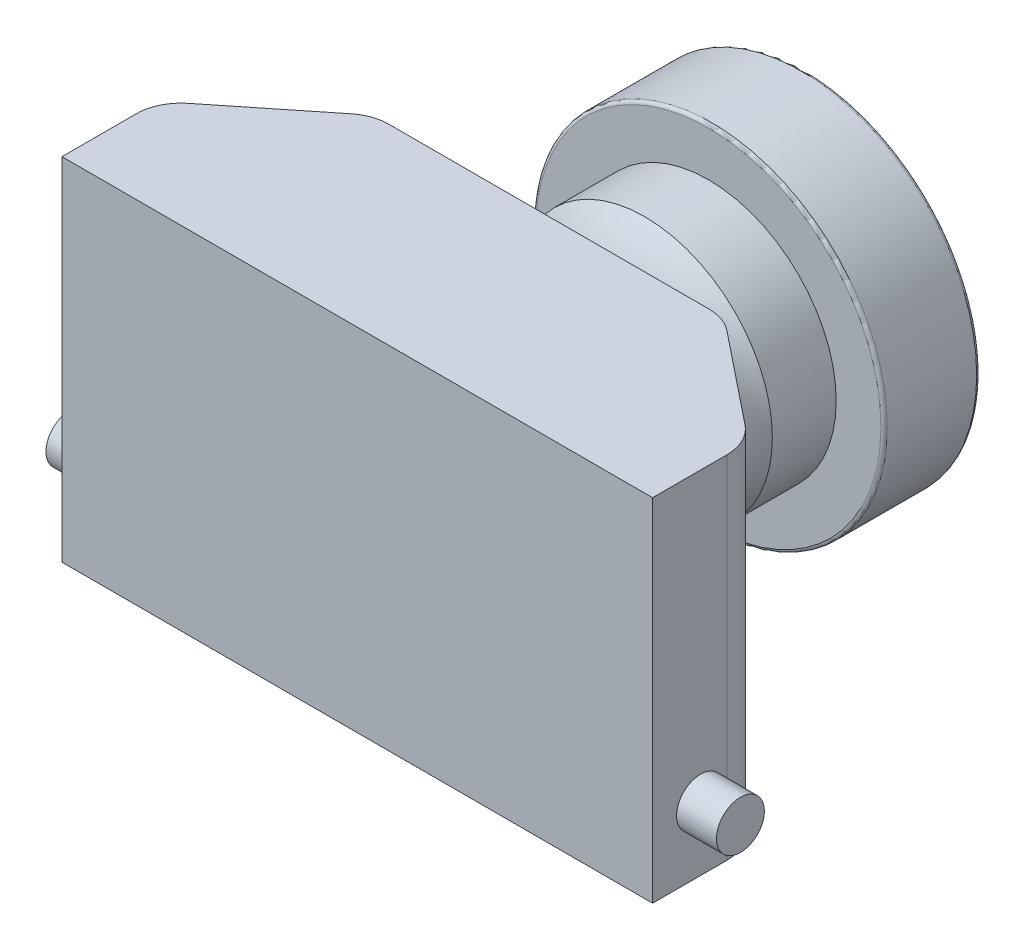
ISO-10303-21;
HEADER;
FILE_DESCRIPTION(('STEP AP214'),'2;1');
FILE_NAME('part.step','',(''),(''),'','','');
FILE_SCHEMA(('AUTOMOTIVE_DESIGN { 1 0 10303 214 1 1 1 1 }'));
ENDSEC;
DATA;
#1=APPLICATION_CONTEXT('core data for automotive mechanical design processes');
#2=APPLICATION_PROTOCOL_DEFINITION('international standard','automotive_design',2000,#1);
#3=PRODUCT_CONTEXT('',#1,'mechanical');
#4=PRODUCT('Part','Part','',(#3));
#5=PRODUCT_RELATED_PRODUCT_CATEGORY('part','',(#4));
#6=PRODUCT_DEFINITION_FORMATION('','',#4);
#7=PRODUCT_DEFINITION_CONTEXT('part definition',#1,'design');
#8=PRODUCT_DEFINITION('design','',#6,#7);
#9=PRODUCT_DEFINITION_SHAPE('','',#8);
#10=(LENGTH_UNIT() NAMED_UNIT(*) SI_UNIT(.MILLI.,.METRE.));
#11=(NAMED_UNIT(*) PLANE_ANGLE_UNIT() SI_UNIT($,.RADIAN.));
#12=(NAMED_UNIT(*) SI_UNIT($,.STERADIAN.) SOLID_ANGLE_UNIT());
#13=UNCERTAINTY_MEASURE_WITH_UNIT(LENGTH_MEASURE(1.E-05),#10,'distance_accuracy_value','');
#14=(GEOMETRIC_REPRESENTATION_CONTEXT(3) GLOBAL_UNCERTAINTY_ASSIGNED_CONTEXT((#13)) GLOBAL_UNIT_ASSIGNED_CONTEXT((#10,
#11,#12)) REPRESENTATION_CONTEXT('',''));
#15=CARTESIAN_POINT('',(0.,0.,0.));
#16=DIRECTION('',(0.,0.,1.));
#17=DIRECTION('',(1.,0.,0.));
#18=AXIS2_PLACEMENT_3D('',#15,#16,#17);
#19=CARTESIAN_POINT('',(0.,0.,-13.8057400215809));
#20=DIRECTION('',(0.,0.,1.));
#21=DIRECTION('',(1.,0.,0.));
#22=AXIS2_PLACEMENT_3D('',#19,#20,#21);
#23=PLANE('',#22);
#24=CARTESIAN_POINT('',(0.,0.,-13.8057400215809));
#25=DIRECTION('',(0.,0.,1.));
#26=DIRECTION('',(1.,0.,0.));
#27=AXIS2_PLACEMENT_3D('',#24,#25,#26);
#28=CIRCLE('',#27,4.75);
#29=CARTESIAN_POINT('',(4.75,0.,-13.8057400215809));
#30=VERTEX_POINT('',#29);
#31=EDGE_CURVE('E12',#30,#30,#28,.T.);
#32=ORIENTED_EDGE('',*,*,#31,.T.);
#33=EDGE_LOOP('',(#32));
#34=FACE_BOUND('',#33,.T.);
#35=ADVANCED_FACE('F42',(#34),#23,.T.);
#36=CARTESIAN_POINT('',(0.0908660493505876,0.,-3.45610375599622));
#37=DIRECTION('',(0.,-1.,0.));
#38=DIRECTION('',(1.,0.,0.));
#39=AXIS2_PLACEMENT_3D('',#36,#37,#38);
#40=CIRCLE('',#39,11.35);
#41=TRIMMED_CURVE('',#40,(PARAMETER_VALUE(-1.57880223164309)),
(PARAMETER_VALUE(1.57880223164309)),.T.,.PARAMETER.);
#42=CARTESIAN_POINT('',(0.,0.,-3.45610375599622));
#43=DIRECTION('',(0.,0.,1.));
#44=AXIS1_PLACEMENT('',#42,#43);
#45=SURFACE_OF_REVOLUTION('',#41,#44);
#46=CARTESIAN_POINT('',(0.,0.,-14.8057400215809));
#47=VERTEX_POINT('',#46);
#48=VERTEX_LOOP('',#47);
#49=FACE_BOUND('',#48,.T.);
#50=ORIENTED_EDGE('',*,*,#31,.F.);
#51=EDGE_LOOP('',(#50));
#52=FACE_BOUND('',#51,.T.);
#53=ADVANCED_FACE('F49',(#49,#52),#45,.T.);
#54=CLOSED_SHELL('',(#35,#53));
#55=MANIFOLD_SOLID_BREP('B2',#54);
#56=CARTESIAN_POINT('',(9.25,5.5,-3.));
#57=DIRECTION('',(-1.,0.,0.));
#58=DIRECTION('',(0.,0.,1.));
#59=AXIS2_PLACEMENT_3D('',#56,#57,#58);
#60=PLANE('',#59);
#61=CARTESIAN_POINT('',(9.25,-3.5,-1.5));
#62=DIRECTION('',(-1.,0.,0.));
#63=DIRECTION('',(0.,0.,1.));
#64=AXIS2_PLACEMENT_3D('',#61,#62,#63);
#65=CIRCLE('',#64,0.75);
#66=CARTESIAN_POINT('',(9.25,-3.5,-0.75));
#67=VERTEX_POINT('',#66);
#68=EDGE_CURVE('E191',#67,#67,#65,.F.);
#69=ORIENTED_EDGE('',*,*,#68,.F.);
#70=EDGE_LOOP('',(#69));
#71=FACE_BOUND('',#70,.T.);
#72=DIRECTION('',(0.,0.,-1.));
#73=VECTOR('',#72,1.);
#74=CARTESIAN_POINT('',(9.25,-5.5,-3.));
#75=LINE('',#74,#73);
#76=CARTESIAN_POINT('',(9.25,-5.5,0.));
#77=VERTEX_POINT('',#76);
#78=CARTESIAN_POINT('',(9.25,-5.5,-2.3271252135188));
#79=VERTEX_POINT('',#78);
#80=EDGE_CURVE('E173',#77,#79,#75,.T.);
#81=ORIENTED_EDGE('',*,*,#80,.T.);
#82=DIRECTION('',(0.,-1.,0.));
#83=VECTOR('',#82,1.);
#84=CARTESIAN_POINT('',(9.25,5.5,-2.3271252135188));
#85=LINE('',#84,#83);
#86=CARTESIAN_POINT('',(9.25,5.5,-2.3271252135188));
#87=VERTEX_POINT('',#86);
#88=EDGE_CURVE('E223',#79,#87,#85,.F.);
#89=ORIENTED_EDGE('',*,*,#88,.T.);
#90=DIRECTION('',(0.,0.,-1.));
#91=VECTOR('',#90,1.);
#92=CARTESIAN_POINT('',(9.25,5.5,-3.));
#93=LINE('',#92,#91);
#94=CARTESIAN_POINT('',(9.25,5.5,0.));
#95=VERTEX_POINT('',#94);
#96=EDGE_CURVE('E187',#95,#87,#93,.T.);
#97=ORIENTED_EDGE('',*,*,#96,.F.);
#98=DIRECTION('',(0.,-1.,0.));
#99=VECTOR('',#98,1.);
#100=CARTESIAN_POINT('',(9.25,5.5,0.));
#101=LINE('',#100,#99);
#102=EDGE_CURVE('E164',#95,#77,#101,.T.);
#103=ORIENTED_EDGE('',*,*,#102,.T.);
#104=EDGE_LOOP('',(#81,#89,#97,#103));
#105=FACE_BOUND('',#104,.T.);
#106=ADVANCED_FACE('F69',(#71,#105),#60,.F.);
#107=CARTESIAN_POINT('',(5.5,5.5,-6.));
#108=DIRECTION('',(-0.624695047554424,0.,0.780868809443031));
#109=DIRECTION('',(0.780868809443031,0.,0.624695047554424));
#110=AXIS2_PLACEMENT_3D('',#107,#108,#109);
#111=PLANE('',#110);
#112=DIRECTION('',(-0.780868809443031,0.,-0.624695047554424));
#113=VECTOR('',#112,1.);
#114=CARTESIAN_POINT('',(5.5,5.5,-6.));
#115=LINE('',#114,#113);
#116=CARTESIAN_POINT('',(8.72457306657619,5.5,-3.42034154673905));
#117=VERTEX_POINT('',#116);
#118=CARTESIAN_POINT('',(5.8834795834747,5.5,-5.69321633322024));
#119=VERTEX_POINT('',#118);
#120=EDGE_CURVE('E257',#117,#119,#115,.T.);
#121=ORIENTED_EDGE('',*,*,#120,.F.);
#122=DIRECTION('',(0.,-1.,0.));
#123=VECTOR('',#122,1.);
#124=CARTESIAN_POINT('',(8.72457306657619,5.5,-3.42034154673905));
#125=LINE('',#124,#123);
#126=CARTESIAN_POINT('',(8.72457306657619,-5.5,-3.42034154673905));
#127=VERTEX_POINT('',#126);
#128=EDGE_CURVE('E212',#117,#127,#125,.T.);
#129=ORIENTED_EDGE('',*,*,#128,.T.);
#130=DIRECTION('',(-0.780868809443031,0.,-0.624695047554424));
#131=VECTOR('',#130,1.);
#132=CARTESIAN_POINT('',(5.5,-5.5,-6.));
#133=LINE('',#132,#131);
#134=CARTESIAN_POINT('',(5.8834795834747,-5.5,-5.69321633322024));
#135=VERTEX_POINT('',#134);
#136=EDGE_CURVE('E176',#127,#135,#133,.T.);
#137=ORIENTED_EDGE('',*,*,#136,.T.);
#138=DIRECTION('',(0.,-1.,0.));
#139=VECTOR('',#138,1.);
#140=CARTESIAN_POINT('',(5.8834795834747,5.5,-5.69321633322024));
#141=LINE('',#140,#139);
#142=EDGE_CURVE('E210',#135,#119,#141,.F.);
#143=ORIENTED_EDGE('',*,*,#142,.T.);
#144=EDGE_LOOP('',(#121,#129,#137,#143));
#145=FACE_BOUND('',#144,.T.);
#146=ADVANCED_FACE('F294',(#145),#111,.F.);
#147=CARTESIAN_POINT('',(-5.5,5.5,-6.));
#148=DIRECTION('',(0.,0.,1.));
#149=DIRECTION('',(1.,0.,0.));
#150=AXIS2_PLACEMENT_3D('',#147,#148,#149);
#151=PLANE('',#150);
#152=CARTESIAN_POINT('',(0.,0.,-6.));
#153=DIRECTION('',(0.,0.,1.));
#154=DIRECTION('',(1.,0.,0.));
#155=AXIS2_PLACEMENT_3D('',#152,#153,#154);
#156=CIRCLE('',#155,4.5);
#157=CARTESIAN_POINT('',(4.5,0.,-6.));
#158=VERTEX_POINT('',#157);
#159=EDGE_CURVE('E271',#158,#158,#156,.T.);
#160=ORIENTED_EDGE('',*,*,#159,.T.);
#161=EDGE_LOOP('',(#160));
#162=FACE_BOUND('',#161,.T.);
#163=DIRECTION('',(-1.,0.,0.));
#164=VECTOR('',#163,1.);
#165=CARTESIAN_POINT('',(-5.5,-5.5,-6.));
#166=LINE('',#165,#164);
#167=CARTESIAN_POINT('',(5.0089065168985,-5.5,-6.));
#168=VERTEX_POINT('',#167);
#169=CARTESIAN_POINT('',(-5.0089065168985,-5.5,-6.));
#170=VERTEX_POINT('',#169);
#171=EDGE_CURVE('E180',#168,#170,#166,.T.);
#172=ORIENTED_EDGE('',*,*,#171,.T.);
#173=DIRECTION('',(0.,-1.,0.));
#174=VECTOR('',#173,1.);
#175=CARTESIAN_POINT('',(-5.0089065168985,5.5,-6.));
#176=LINE('',#175,#174);
#177=CARTESIAN_POINT('',(-5.0089065168985,5.5,-6.));
#178=VERTEX_POINT('',#177);
#179=EDGE_CURVE('E40',#170,#178,#176,.F.);
#180=ORIENTED_EDGE('',*,*,#179,.T.);
#181=DIRECTION('',(-1.,0.,0.));
#182=VECTOR('',#181,1.);
#183=CARTESIAN_POINT('',(-5.5,5.5,-6.));
#184=LINE('',#183,#182);
#185=CARTESIAN_POINT('',(5.0089065168985,5.5,-6.));
#186=VERTEX_POINT('',#185);
#187=EDGE_CURVE('E245',#186,#178,#184,.T.);
#188=ORIENTED_EDGE('',*,*,#187,.F.);
#189=DIRECTION('',(0.,-1.,0.));
#190=VECTOR('',#189,1.);
#191=CARTESIAN_POINT('',(5.0089065168985,5.5,-6.));
#192=LINE('',#191,#190);
#193=EDGE_CURVE('E77',#186,#168,#192,.T.);
#194=ORIENTED_EDGE('',*,*,#193,.T.);
#195=EDGE_LOOP('',(#172,#180,#188,#194));
#196=FACE_BOUND('',#195,.T.);
#197=ADVANCED_FACE('F242',(#162,#196),#151,.F.);
#198=CARTESIAN_POINT('',(-9.25,5.5,-3.));
#199=DIRECTION('',(0.624695047554424,0.,0.78086880944303));
#200=DIRECTION('',(0.78086880944303,0.,-0.624695047554424));
#201=AXIS2_PLACEMENT_3D('',#198,#199,#200);
#202=PLANE('',#201);
#203=DIRECTION('',(-0.78086880944303,0.,0.624695047554424));
#204=VECTOR('',#203,1.);
#205=CARTESIAN_POINT('',(-9.25,-5.5,-3.));
#206=LINE('',#205,#204);
#207=CARTESIAN_POINT('',(-5.8834795834747,-5.5,-5.69321633322024));
#208=VERTEX_POINT('',#207);
#209=CARTESIAN_POINT('',(-8.72457306657619,-5.5,-3.42034154673905));
#210=VERTEX_POINT('',#209);
#211=EDGE_CURVE('E183',#208,#210,#206,.T.);
#212=ORIENTED_EDGE('',*,*,#211,.T.);
#213=DIRECTION('',(0.,-1.,0.));
#214=VECTOR('',#213,1.);
#215=CARTESIAN_POINT('',(-8.72457306657619,5.5,-3.42034154673905));
#216=LINE('',#215,#214);
#217=CARTESIAN_POINT('',(-8.72457306657619,5.5,-3.42034154673905));
#218=VERTEX_POINT('',#217);
#219=EDGE_CURVE('E92',#210,#218,#216,.F.);
#220=ORIENTED_EDGE('',*,*,#219,.T.);
#221=DIRECTION('',(-0.78086880944303,0.,0.624695047554424));
#222=VECTOR('',#221,1.);
#223=CARTESIAN_POINT('',(-9.25,5.5,-3.));
#224=LINE('',#223,#222);
#225=CARTESIAN_POINT('',(-5.8834795834747,5.5,-5.69321633322024));
#226=VERTEX_POINT('',#225);
#227=EDGE_CURVE('E154',#226,#218,#224,.T.);
#228=ORIENTED_EDGE('',*,*,#227,.F.);
#229=DIRECTION('',(0.,-1.,0.));
#230=VECTOR('',#229,1.);
#231=CARTESIAN_POINT('',(-5.8834795834747,5.5,-5.69321633322024));
#232=LINE('',#231,#230);
#233=EDGE_CURVE('E234',#226,#208,#232,.T.);
#234=ORIENTED_EDGE('',*,*,#233,.T.);
#235=EDGE_LOOP('',(#212,#220,#228,#234));
#236=FACE_BOUND('',#235,.T.);
#237=ADVANCED_FACE('F256',(#236),#202,.F.);
#238=CARTESIAN_POINT('',(-9.25,5.5,0.));
#239=DIRECTION('',(1.,0.,0.));
#240=DIRECTION('',(0.,0.,-1.));
#241=AXIS2_PLACEMENT_3D('',#238,#239,#240);
#242=PLANE('',#241);
#243=CARTESIAN_POINT('',(-9.25,-3.5,-1.5));
#244=DIRECTION('',(1.,0.,0.));
#245=DIRECTION('',(0.,0.,-1.));
#246=AXIS2_PLACEMENT_3D('',#243,#244,#245);
#247=CIRCLE('',#246,0.75);
#248=CARTESIAN_POINT('',(-9.25,-3.5,-0.75));
#249=VERTEX_POINT('',#248);
#250=EDGE_CURVE('E163',#249,#249,#247,.F.);
#251=ORIENTED_EDGE('',*,*,#250,.F.);
#252=EDGE_LOOP('',(#251));
#253=FACE_BOUND('',#252,.T.);
#254=DIRECTION('',(0.,0.,1.));
#255=VECTOR('',#254,1.);
#256=CARTESIAN_POINT('',(-9.25,5.5,0.));
#257=LINE('',#256,#255);
#258=CARTESIAN_POINT('',(-9.25,5.5,-2.3271252135188));
#259=VERTEX_POINT('',#258);
#260=CARTESIAN_POINT('',(-9.25,5.5,0.));
#261=VERTEX_POINT('',#260);
#262=EDGE_CURVE('E144',#259,#261,#257,.T.);
#263=ORIENTED_EDGE('',*,*,#262,.F.);
#264=DIRECTION('',(0.,-1.,0.));
#265=VECTOR('',#264,1.);
#266=CARTESIAN_POINT('',(-9.25,5.5,-2.3271252135188));
#267=LINE('',#266,#265);
#268=CARTESIAN_POINT('',(-9.25,-5.5,-2.3271252135188));
#269=VERTEX_POINT('',#268);
#270=EDGE_CURVE('E232',#259,#269,#267,.T.);
#271=ORIENTED_EDGE('',*,*,#270,.T.);
#272=DIRECTION('',(0.,0.,1.));
#273=VECTOR('',#272,1.);
#274=CARTESIAN_POINT('',(-9.25,-5.5,0.));
#275=LINE('',#274,#273);
#276=CARTESIAN_POINT('',(-9.25,-5.5,0.));
#277=VERTEX_POINT('',#276);
#278=EDGE_CURVE('E160',#269,#277,#275,.T.);
#279=ORIENTED_EDGE('',*,*,#278,.T.);
#280=DIRECTION('',(0.,-1.,0.));
#281=VECTOR('',#280,1.);
#282=CARTESIAN_POINT('',(-9.25,5.5,0.));
#283=LINE('',#282,#281);
#284=EDGE_CURVE('E157',#261,#277,#283,.T.);
#285=ORIENTED_EDGE('',*,*,#284,.F.);
#286=EDGE_LOOP('',(#263,#271,#279,#285));
#287=FACE_BOUND('',#286,.T.);
#288=ADVANCED_FACE('F158',(#253,#287),#242,.F.);
#289=CARTESIAN_POINT('',(-9.25,5.5,0.));
#290=DIRECTION('',(0.,0.,-1.));
#291=DIRECTION('',(-1.,0.,0.));
#292=AXIS2_PLACEMENT_3D('',#289,#290,#291);
#293=PLANE('',#292);
#294=DIRECTION('',(1.,0.,0.));
#295=VECTOR('',#294,1.);
#296=CARTESIAN_POINT('',(-9.25,-5.5,0.));
#297=LINE('',#296,#295);
#298=EDGE_CURVE('E186',#277,#77,#297,.T.);
#299=ORIENTED_EDGE('',*,*,#298,.T.);
#300=ORIENTED_EDGE('',*,*,#102,.F.);
#301=DIRECTION('',(1.,0.,0.));
#302=VECTOR('',#301,1.);
#303=CARTESIAN_POINT('',(-9.25,5.5,0.));
#304=LINE('',#303,#302);
#305=EDGE_CURVE('E149',#261,#95,#304,.T.);
#306=ORIENTED_EDGE('',*,*,#305,.F.);
#307=ORIENTED_EDGE('',*,*,#284,.T.);
#308=EDGE_LOOP('',(#299,#300,#306,#307));
#309=FACE_BOUND('',#308,.T.);
#310=ADVANCED_FACE('F166',(#309),#293,.F.);
#311=CARTESIAN_POINT('',(0.,5.5,0.));
#312=DIRECTION('',(0.,1.,0.));
#313=DIRECTION('',(0.,0.,1.));
#314=AXIS2_PLACEMENT_3D('',#311,#312,#313);
#315=PLANE('',#314);
#316=ORIENTED_EDGE('',*,*,#96,.T.);
#317=CARTESIAN_POINT('',(7.85,5.5,-2.3271252135188));
#318=DIRECTION('',(0.,1.,0.));
#319=DIRECTION('',(0.,0.,1.));
#320=AXIS2_PLACEMENT_3D('',#317,#318,#319);
#321=CIRCLE('',#320,1.4);
#322=EDGE_CURVE('E230',#87,#117,#321,.T.);
#323=ORIENTED_EDGE('',*,*,#322,.T.);
#324=ORIENTED_EDGE('',*,*,#120,.T.);
#325=CARTESIAN_POINT('',(5.0089065168985,5.5,-4.6));
#326=DIRECTION('',(0.,1.,0.));
#327=DIRECTION('',(0.,0.,1.));
#328=AXIS2_PLACEMENT_3D('',#325,#326,#327);
#329=CIRCLE('',#328,1.4);
#330=EDGE_CURVE('E225',#119,#186,#329,.T.);
#331=ORIENTED_EDGE('',*,*,#330,.T.);
#332=ORIENTED_EDGE('',*,*,#187,.T.);
#333=CARTESIAN_POINT('',(-5.0089065168985,5.5,-4.6));
#334=DIRECTION('',(0.,1.,0.));
#335=DIRECTION('',(0.,0.,1.));
#336=AXIS2_PLACEMENT_3D('',#333,#334,#335);
#337=CIRCLE('',#336,1.4);
#338=EDGE_CURVE('E227',#178,#226,#337,.T.);
#339=ORIENTED_EDGE('',*,*,#338,.T.);
#340=ORIENTED_EDGE('',*,*,#227,.T.);
#341=CARTESIAN_POINT('',(-7.85,5.5,-2.3271252135188));
#342=DIRECTION('',(0.,1.,0.));
#343=DIRECTION('',(0.,0.,1.));
#344=AXIS2_PLACEMENT_3D('',#341,#342,#343);
#345=CIRCLE('',#344,1.4);
#346=EDGE_CURVE('E84',#218,#259,#345,.T.);
#347=ORIENTED_EDGE('',*,*,#346,.T.);
#348=ORIENTED_EDGE('',*,*,#262,.T.);
#349=ORIENTED_EDGE('',*,*,#305,.T.);
#350=EDGE_LOOP('',(#316,#323,#324,#331,#332,#339,#340,#347,#348,#349));
#351=FACE_BOUND('',#350,.T.);
#352=ADVANCED_FACE('F147',(#351),#315,.T.);
#353=CARTESIAN_POINT('',(0.,-5.5,0.));
#354=DIRECTION('',(0.,1.,0.));
#355=DIRECTION('',(0.,0.,1.));
#356=AXIS2_PLACEMENT_3D('',#353,#354,#355);
#357=PLANE('',#356);
#358=ORIENTED_EDGE('',*,*,#136,.F.);
#359=CARTESIAN_POINT('',(7.85,-5.5,-2.3271252135188));
#360=DIRECTION('',(0.,1.,0.));
#361=DIRECTION('',(0.,0.,1.));
#362=AXIS2_PLACEMENT_3D('',#359,#360,#361);
#363=CIRCLE('',#362,1.4);
#364=EDGE_CURVE('E221',#127,#79,#363,.F.);
#365=ORIENTED_EDGE('',*,*,#364,.T.);
#366=ORIENTED_EDGE('',*,*,#80,.F.);
#367=ORIENTED_EDGE('',*,*,#298,.F.);
#368=ORIENTED_EDGE('',*,*,#278,.F.);
#369=CARTESIAN_POINT('',(-7.85,-5.5,-2.3271252135188));
#370=DIRECTION('',(0.,1.,0.));
#371=DIRECTION('',(0.,0.,1.));
#372=AXIS2_PLACEMENT_3D('',#369,#370,#371);
#373=CIRCLE('',#372,1.4);
#374=EDGE_CURVE('E219',#269,#210,#373,.F.);
#375=ORIENTED_EDGE('',*,*,#374,.T.);
#376=ORIENTED_EDGE('',*,*,#211,.F.);
#377=CARTESIAN_POINT('',(-5.0089065168985,-5.5,-4.6));
#378=DIRECTION('',(0.,1.,0.));
#379=DIRECTION('',(0.,0.,1.));
#380=AXIS2_PLACEMENT_3D('',#377,#378,#379);
#381=CIRCLE('',#380,1.4);
#382=EDGE_CURVE('E217',#208,#170,#381,.F.);
#383=ORIENTED_EDGE('',*,*,#382,.T.);
#384=ORIENTED_EDGE('',*,*,#171,.F.);
#385=CARTESIAN_POINT('',(5.0089065168985,-5.5,-4.6));
#386=DIRECTION('',(0.,1.,0.));
#387=DIRECTION('',(0.,0.,1.));
#388=AXIS2_PLACEMENT_3D('',#385,#386,#387);
#389=CIRCLE('',#388,1.4);
#390=EDGE_CURVE('E215',#168,#135,#389,.F.);
#391=ORIENTED_EDGE('',*,*,#390,.T.);
#392=EDGE_LOOP('',(#358,#365,#366,#367,#368,#375,#376,#383,#384,#391));
#393=FACE_BOUND('',#392,.T.);
#394=ADVANCED_FACE('F250',(#393),#357,.F.);
#395=CARTESIAN_POINT('',(0.,0.,-7.82621912715063));
#396=DIRECTION('',(0.,0.,1.));
#397=DIRECTION('',(1.,0.,0.));
#398=AXIS2_PLACEMENT_3D('',#395,#396,#397);
#399=TOROIDAL_SURFACE('',#398,6.20731476290378,2.5);
#400=CARTESIAN_POINT('',(0.,0.,-9.));
#401=DIRECTION('',(0.,0.,1.));
#402=DIRECTION('',(1.,0.,0.));
#403=AXIS2_PLACEMENT_3D('',#400,#401,#402);
#404=CIRCLE('',#403,4.);
#405=CARTESIAN_POINT('',(4.,0.,-9.));
#406=VERTEX_POINT('',#405);
#407=EDGE_CURVE('E177',#406,#406,#404,.T.);
#408=ORIENTED_EDGE('',*,*,#407,.T.);
#409=EDGE_LOOP('',(#408));
#410=FACE_BOUND('',#409,.T.);
#411=ORIENTED_EDGE('',*,*,#159,.F.);
#412=EDGE_LOOP('',(#411));
#413=FACE_BOUND('',#412,.T.);
#414=ADVANCED_FACE('F344',(#410,#413),#399,.F.);
#415=CARTESIAN_POINT('',(0.,0.,0.));
#416=DIRECTION('',(0.,0.,1.));
#417=DIRECTION('',(1.,0.,0.));
#418=AXIS2_PLACEMENT_3D('',#415,#416,#417);
#419=CYLINDRICAL_SURFACE('',#418,4.);
#420=CARTESIAN_POINT('',(0.,0.,-11.));
#421=DIRECTION('',(0.,0.,1.));
#422=DIRECTION('',(1.,0.,0.));
#423=AXIS2_PLACEMENT_3D('',#420,#421,#422);
#424=CIRCLE('',#423,4.);
#425=CARTESIAN_POINT('',(4.,0.,-11.));
#426=VERTEX_POINT('',#425);
#427=EDGE_CURVE('E265',#426,#426,#424,.T.);
#428=ORIENTED_EDGE('',*,*,#427,.T.);
#429=EDGE_LOOP('',(#428));
#430=FACE_BOUND('',#429,.T.);
#431=ORIENTED_EDGE('',*,*,#407,.F.);
#432=EDGE_LOOP('',(#431));
#433=FACE_BOUND('',#432,.T.);
#434=ADVANCED_FACE('F349',(#430,#433),#419,.T.);
#435=CARTESIAN_POINT('',(5.5,0.,-11.));
#436=DIRECTION('',(0.,0.,1.));
#437=DIRECTION('',(1.,0.,0.));
#438=AXIS2_PLACEMENT_3D('',#435,#436,#437);
#439=PLANE('',#438);
#440=CARTESIAN_POINT('',(0.,0.,-11.));
#441=DIRECTION('',(0.,0.,1.));
#442=DIRECTION('',(1.,0.,0.));
#443=AXIS2_PLACEMENT_3D('',#440,#441,#442);
#444=CIRCLE('',#443,5.4);
#445=CARTESIAN_POINT('',(5.4,0.,-11.));
#446=VERTEX_POINT('',#445);
#447=EDGE_CURVE('E192',#446,#446,#444,.T.);
#448=ORIENTED_EDGE('',*,*,#447,.T.);
#449=EDGE_LOOP('',(#448));
#450=FACE_BOUND('',#449,.T.);
#451=ORIENTED_EDGE('',*,*,#427,.F.);
#452=EDGE_LOOP('',(#451));
#453=FACE_BOUND('',#452,.T.);
#454=ADVANCED_FACE('F353',(#450,#453),#439,.T.);
#455=CARTESIAN_POINT('',(0.,0.,0.));
#456=DIRECTION('',(0.,0.,1.));
#457=DIRECTION('',(1.,0.,0.));
#458=AXIS2_PLACEMENT_3D('',#455,#456,#457);
#459=CYLINDRICAL_SURFACE('',#458,5.5);
#460=CARTESIAN_POINT('',(0.,0.,-11.1));
#461=DIRECTION('',(0.,0.,1.));
#462=DIRECTION('',(1.,0.,0.));
#463=AXIS2_PLACEMENT_3D('',#460,#461,#462);
#464=CIRCLE('',#463,5.5);
#465=CARTESIAN_POINT('',(5.5,0.,-11.1));
#466=VERTEX_POINT('',#465);
#467=EDGE_CURVE('E198',#466,#466,#464,.F.);
#468=ORIENTED_EDGE('',*,*,#467,.T.);
#469=EDGE_LOOP('',(#468));
#470=FACE_BOUND('',#469,.T.);
#471=CARTESIAN_POINT('',(0.,0.,-13.9));
#472=DIRECTION('',(0.,0.,-1.));
#473=DIRECTION('',(-1.,0.,0.));
#474=AXIS2_PLACEMENT_3D('',#471,#472,#473);
#475=CIRCLE('',#474,5.5);
#476=CARTESIAN_POINT('',(-5.5,0.,-13.9));
#477=VERTEX_POINT('',#476);
#478=EDGE_CURVE('E195',#477,#477,#475,.F.);
#479=ORIENTED_EDGE('',*,*,#478,.T.);
#480=EDGE_LOOP('',(#479));
#481=FACE_BOUND('',#480,.T.);
#482=ADVANCED_FACE('F357',(#470,#481),#459,.T.);
#483=CARTESIAN_POINT('',(5.,0.,-14.));
#484=DIRECTION('',(0.,0.,-1.));
#485=DIRECTION('',(-1.,0.,0.));
#486=AXIS2_PLACEMENT_3D('',#483,#484,#485);
#487=PLANE('',#486);
#488=CARTESIAN_POINT('',(0.,0.,-14.));
#489=DIRECTION('',(0.,0.,-1.));
#490=DIRECTION('',(-1.,0.,0.));
#491=AXIS2_PLACEMENT_3D('',#488,#489,#490);
#492=CIRCLE('',#491,5.4);
#493=CARTESIAN_POINT('',(-5.4,0.,-14.));
#494=VERTEX_POINT('',#493);
#495=EDGE_CURVE('E204',#494,#494,#492,.T.);
#496=ORIENTED_EDGE('',*,*,#495,.T.);
#497=EDGE_LOOP('',(#496));
#498=FACE_BOUND('',#497,.T.);
#499=CARTESIAN_POINT('',(0.,0.,-14.));
#500=DIRECTION('',(0.,0.,-1.));
#501=DIRECTION('',(-1.,0.,0.));
#502=AXIS2_PLACEMENT_3D('',#499,#500,#501);
#503=CIRCLE('',#502,5.1);
#504=CARTESIAN_POINT('',(-5.1,0.,-14.));
#505=VERTEX_POINT('',#504);
#506=EDGE_CURVE('E201',#505,#505,#503,.F.);
#507=ORIENTED_EDGE('',*,*,#506,.T.);
#508=EDGE_LOOP('',(#507));
#509=FACE_BOUND('',#508,.T.);
#510=ADVANCED_FACE('F361',(#498,#509),#487,.T.);
#511=CARTESIAN_POINT('',(0.,0.,0.));
#512=DIRECTION('',(0.,0.,1.));
#513=DIRECTION('',(1.,0.,0.));
#514=AXIS2_PLACEMENT_3D('',#511,#512,#513);
#515=CYLINDRICAL_SURFACE('',#514,5.);
#516=CARTESIAN_POINT('',(0.,0.,-13.9));
#517=DIRECTION('',(0.,0.,-1.));
#518=DIRECTION('',(-1.,0.,0.));
#519=AXIS2_PLACEMENT_3D('',#516,#517,#518);
#520=CIRCLE('',#519,5.);
#521=CARTESIAN_POINT('',(-5.,0.,-13.9));
#522=VERTEX_POINT('',#521);
#523=EDGE_CURVE('E207',#522,#522,#520,.T.);
#524=ORIENTED_EDGE('',*,*,#523,.T.);
#525=EDGE_LOOP('',(#524));
#526=FACE_BOUND('',#525,.T.);
#527=CARTESIAN_POINT('',(0.,0.,-13.8));
#528=DIRECTION('',(0.,0.,1.));
#529=DIRECTION('',(1.,0.,0.));
#530=AXIS2_PLACEMENT_3D('',#527,#528,#529);
#531=CIRCLE('',#530,5.);
#532=CARTESIAN_POINT('',(5.,0.,-13.8));
#533=VERTEX_POINT('',#532);
#534=EDGE_CURVE('E268',#533,#533,#531,.T.);
#535=ORIENTED_EDGE('',*,*,#534,.T.);
#536=EDGE_LOOP('',(#535));
#537=FACE_BOUND('',#536,.T.);
#538=ADVANCED_FACE('F365',(#526,#537),#515,.F.);
#539=CARTESIAN_POINT('',(0.,0.,-13.8));
#540=DIRECTION('',(0.,0.,-1.));
#541=DIRECTION('',(-1.,0.,0.));
#542=AXIS2_PLACEMENT_3D('',#539,#540,#541);
#543=PLANE('',#542);
#544=ORIENTED_EDGE('',*,*,#534,.F.);
#545=EDGE_LOOP('',(#544));
#546=FACE_BOUND('',#545,.T.);
#547=ADVANCED_FACE('F369',(#546),#543,.T.);
#548=CARTESIAN_POINT('',(-10.5,-3.5,-1.5));
#549=DIRECTION('',(1.,0.,0.));
#550=DIRECTION('',(0.,0.,-1.));
#551=AXIS2_PLACEMENT_3D('',#548,#549,#550);
#552=PLANE('',#551);
#553=CARTESIAN_POINT('',(-10.5,-3.5,-1.5));
#554=DIRECTION('',(1.,0.,0.));
#555=DIRECTION('',(0.,0.,-1.));
#556=AXIS2_PLACEMENT_3D('',#553,#554,#555);
#557=CIRCLE('',#556,0.75);
#558=CARTESIAN_POINT('',(-10.5,-3.5,-0.75));
#559=VERTEX_POINT('',#558);
#560=EDGE_CURVE('E277',#559,#559,#557,.T.);
#561=ORIENTED_EDGE('',*,*,#560,.F.);
#562=EDGE_LOOP('',(#561));
#563=FACE_BOUND('',#562,.T.);
#564=ADVANCED_FACE('F372',(#563),#552,.F.);
#565=CARTESIAN_POINT('',(10.5,-3.5,-1.5));
#566=DIRECTION('',(-1.,0.,0.));
#567=DIRECTION('',(0.,0.,1.));
#568=AXIS2_PLACEMENT_3D('',#565,#566,#567);
#569=CYLINDRICAL_SURFACE('',#568,0.75);
#570=CARTESIAN_POINT('',(-10.5,-3.5,-0.75));
#571=CARTESIAN_POINT('',(-10.4869791666667,-3.5,-0.75));
#572=CARTESIAN_POINT('',(-10.4739583333333,-3.5,-0.75));
#573=CARTESIAN_POINT('',(-10.4479166666667,-3.5,-0.75));
#574=CARTESIAN_POINT('',(-10.4348958333333,-3.5,-0.75));
#575=CARTESIAN_POINT('',(-10.4088541666667,-3.5,-0.75));
#576=CARTESIAN_POINT('',(-10.3958333333333,-3.5,-0.75));
#577=CARTESIAN_POINT('',(-10.3697916666667,-3.5,-0.75));
#578=CARTESIAN_POINT('',(-10.3567708333333,-3.5,-0.75));
#579=CARTESIAN_POINT('',(-10.3307291666667,-3.5,-0.75));
#580=CARTESIAN_POINT('',(-10.3177083333333,-3.5,-0.75));
#581=CARTESIAN_POINT('',(-10.2916666666667,-3.5,-0.75));
#582=CARTESIAN_POINT('',(-10.2786458333333,-3.5,-0.75));
#583=CARTESIAN_POINT('',(-10.2526041666667,-3.5,-0.75));
#584=CARTESIAN_POINT('',(-10.2395833333333,-3.5,-0.75));
#585=CARTESIAN_POINT('',(-10.2135416666667,-3.5,-0.75));
#586=CARTESIAN_POINT('',(-10.2005208333333,-3.5,-0.75));
#587=CARTESIAN_POINT('',(-10.1744791666667,-3.5,-0.75));
#588=CARTESIAN_POINT('',(-10.1614583333333,-3.5,-0.75));
#589=CARTESIAN_POINT('',(-10.1354166666667,-3.5,-0.75));
#590=CARTESIAN_POINT('',(-10.1223958333333,-3.5,-0.75));
#591=CARTESIAN_POINT('',(-10.0963541666667,-3.5,-0.75));
#592=CARTESIAN_POINT('',(-10.0833333333333,-3.5,-0.75));
#593=CARTESIAN_POINT('',(-10.0572916666667,-3.5,-0.75));
#594=CARTESIAN_POINT('',(-10.0442708333333,-3.5,-0.75));
#595=CARTESIAN_POINT('',(-10.0182291666667,-3.5,-0.75));
#596=CARTESIAN_POINT('',(-10.0052083333333,-3.5,-0.75));
#597=CARTESIAN_POINT('',(-9.97916666666667,-3.5,-0.75));
#598=CARTESIAN_POINT('',(-9.96614583333333,-3.5,-0.75));
#599=CARTESIAN_POINT('',(-9.94010416666666,-3.5,-0.75));
#600=CARTESIAN_POINT('',(-9.92708333333333,-3.5,-0.75));
#601=CARTESIAN_POINT('',(-9.90104166666667,-3.5,-0.75));
#602=CARTESIAN_POINT('',(-9.88802083333333,-3.5,-0.75));
#603=CARTESIAN_POINT('',(-9.86197916666667,-3.5,-0.75));
#604=CARTESIAN_POINT('',(-9.84895833333333,-3.5,-0.75));
#605=CARTESIAN_POINT('',(-9.82291666666667,-3.5,-0.75));
#606=CARTESIAN_POINT('',(-9.80989583333334,-3.5,-0.75));
#607=CARTESIAN_POINT('',(-9.78385416666667,-3.5,-0.75));
#608=CARTESIAN_POINT('',(-9.77083333333333,-3.5,-0.75));
#609=CARTESIAN_POINT('',(-9.74479166666667,-3.5,-0.75));
#610=CARTESIAN_POINT('',(-9.73177083333333,-3.5,-0.75));
#611=CARTESIAN_POINT('',(-9.70572916666667,-3.5,-0.75));
#612=CARTESIAN_POINT('',(-9.69270833333333,-3.5,-0.75));
#613=CARTESIAN_POINT('',(-9.66666666666667,-3.5,-0.75));
#614=CARTESIAN_POINT('',(-9.65364583333333,-3.5,-0.75));
#615=CARTESIAN_POINT('',(-9.62760416666666,-3.5,-0.75));
#616=CARTESIAN_POINT('',(-9.61458333333333,-3.5,-0.75));
#617=CARTESIAN_POINT('',(-9.58854166666667,-3.5,-0.75));
#618=CARTESIAN_POINT('',(-9.57552083333333,-3.5,-0.75));
#619=CARTESIAN_POINT('',(-9.54947916666667,-3.5,-0.75));
#620=CARTESIAN_POINT('',(-9.53645833333333,-3.5,-0.75));
#621=CARTESIAN_POINT('',(-9.51041666666667,-3.5,-0.75));
#622=CARTESIAN_POINT('',(-9.49739583333334,-3.5,-0.75));
#623=CARTESIAN_POINT('',(-9.47135416666667,-3.5,-0.75));
#624=CARTESIAN_POINT('',(-9.45833333333333,-3.5,-0.75));
#625=CARTESIAN_POINT('',(-9.43229166666667,-3.5,-0.75));
#626=CARTESIAN_POINT('',(-9.41927083333333,-3.5,-0.75));
#627=CARTESIAN_POINT('',(-9.39322916666667,-3.5,-0.75));
#628=CARTESIAN_POINT('',(-9.38020833333333,-3.5,-0.75));
#629=CARTESIAN_POINT('',(-9.35416666666667,-3.5,-0.75));
#630=CARTESIAN_POINT('',(-9.34114583333333,-3.5,-0.75));
#631=CARTESIAN_POINT('',(-9.31510416666666,-3.5,-0.75));
#632=CARTESIAN_POINT('',(-9.30208333333333,-3.5,-0.75));
#633=CARTESIAN_POINT('',(-9.27604166666666,-3.5,-0.75));
#634=CARTESIAN_POINT('',(-9.26302083333333,-3.5,-0.75));
#635=CARTESIAN_POINT('',(-9.25,-3.5,-0.75));
#636=B_SPLINE_CURVE_WITH_KNOTS('',3,(#570,#571,#572,#573,#574,#575,#576,#577,#578,#579,#580,
#581,#582,#583,#584,#585,#586,#587,#588,#589,#590,#591,#592,#593,#594,#595,#596,#597,#598,#599,
#600,#601,#602,#603,#604,#605,#606,#607,#608,#609,#610,#611,#612,#613,#614,#615,#616,#617,#618,
#619,#620,#621,#622,#623,#624,#625,#626,#627,#628,#629,#630,#631,#632,#633,#634,#635),
.UNSPECIFIED.,.F.,.F.,(4,2,2,2,2,2,2,2,2,2,2,2,2,2,2,2,2,2,2,2,2,2,2,2,2,2,2,2,2,2,2,2,4),(0.,
0.0390624999999992,0.0781249999999983,0.117187500000001,0.15625,0.195312499999999,
0.234375000000002,0.273437500000001,0.3125,0.351562499999999,0.390624999999999,
0.429687500000001,0.46875,0.5078125,0.546875000000002,0.585937500000001,0.625000000000001,
0.6640625,0.703124999999999,0.742187500000002,0.781250000000001,0.8203125,0.859375000000002,
0.898437500000002,0.937500000000001,0.9765625,1.015625,1.0546875,1.09375,1.1328125,1.171875,
1.2109375,1.25),.UNSPECIFIED.);
#637=EDGE_CURVE('BSEAM288',#559,#249,#636,.T.);
#638=ORIENTED_EDGE('',*,*,#560,.T.);
#639=ORIENTED_EDGE('',*,*,#250,.T.);
#640=ORIENTED_EDGE('',*,*,#637,.T.);
#641=ORIENTED_EDGE('',*,*,#637,.F.);
#642=EDGE_LOOP('',(#638,#640,#639,#641));
#643=FACE_BOUND('',#642,.T.);
#644=ADVANCED_FACE('F288',(#643),#569,.T.);
#645=CARTESIAN_POINT('',(10.5,-3.5,-1.5));
#646=DIRECTION('',(1.,0.,0.));
#647=DIRECTION('',(0.,0.,-1.));
#648=AXIS2_PLACEMENT_3D('',#645,#646,#647);
#649=CIRCLE('',#648,0.75);
#650=CARTESIAN_POINT('',(10.5,-3.5,-0.75));
#651=VERTEX_POINT('',#650);
#652=EDGE_CURVE('E274',#651,#651,#649,.T.);
#653=CARTESIAN_POINT('',(10.5,-3.5,-0.75));
#654=CARTESIAN_POINT('',(10.4869791666667,-3.5,-0.75));
#655=CARTESIAN_POINT('',(10.4739583333333,-3.5,-0.75));
#656=CARTESIAN_POINT('',(10.4479166666667,-3.5,-0.75));
#657=CARTESIAN_POINT('',(10.4348958333333,-3.5,-0.75));
#658=CARTESIAN_POINT('',(10.4088541666667,-3.5,-0.75));
#659=CARTESIAN_POINT('',(10.3958333333333,-3.5,-0.75));
#660=CARTESIAN_POINT('',(10.3697916666667,-3.5,-0.75));
#661=CARTESIAN_POINT('',(10.3567708333333,-3.5,-0.75));
#662=CARTESIAN_POINT('',(10.3307291666667,-3.5,-0.75));
#663=CARTESIAN_POINT('',(10.3177083333333,-3.5,-0.75));
#664=CARTESIAN_POINT('',(10.2916666666667,-3.5,-0.75));
#665=CARTESIAN_POINT('',(10.2786458333333,-3.5,-0.75));
#666=CARTESIAN_POINT('',(10.2526041666667,-3.5,-0.75));
#667=CARTESIAN_POINT('',(10.2395833333333,-3.5,-0.75));
#668=CARTESIAN_POINT('',(10.2135416666667,-3.5,-0.75));
#669=CARTESIAN_POINT('',(10.2005208333333,-3.5,-0.75));
#670=CARTESIAN_POINT('',(10.1744791666667,-3.5,-0.75));
#671=CARTESIAN_POINT('',(10.1614583333333,-3.5,-0.75));
#672=CARTESIAN_POINT('',(10.1354166666667,-3.5,-0.75));
#673=CARTESIAN_POINT('',(10.1223958333333,-3.5,-0.75));
#674=CARTESIAN_POINT('',(10.0963541666667,-3.5,-0.75));
#675=CARTESIAN_POINT('',(10.0833333333333,-3.5,-0.75));
#676=CARTESIAN_POINT('',(10.0572916666667,-3.5,-0.75));
#677=CARTESIAN_POINT('',(10.0442708333333,-3.5,-0.75));
#678=CARTESIAN_POINT('',(10.0182291666667,-3.5,-0.75));
#679=CARTESIAN_POINT('',(10.0052083333333,-3.5,-0.75));
#680=CARTESIAN_POINT('',(9.97916666666667,-3.5,-0.75));
#681=CARTESIAN_POINT('',(9.96614583333333,-3.5,-0.75));
#682=CARTESIAN_POINT('',(9.94010416666667,-3.5,-0.75));
#683=CARTESIAN_POINT('',(9.92708333333333,-3.5,-0.75));
#684=CARTESIAN_POINT('',(9.90104166666667,-3.5,-0.75));
#685=CARTESIAN_POINT('',(9.88802083333333,-3.5,-0.75));
#686=CARTESIAN_POINT('',(9.86197916666667,-3.5,-0.75));
#687=CARTESIAN_POINT('',(9.84895833333333,-3.5,-0.75));
#688=CARTESIAN_POINT('',(9.82291666666667,-3.5,-0.75));
#689=CARTESIAN_POINT('',(9.80989583333333,-3.5,-0.75));
#690=CARTESIAN_POINT('',(9.78385416666667,-3.5,-0.75));
#691=CARTESIAN_POINT('',(9.77083333333333,-3.5,-0.75));
#692=CARTESIAN_POINT('',(9.74479166666667,-3.5,-0.75));
#693=CARTESIAN_POINT('',(9.73177083333333,-3.5,-0.75));
#694=CARTESIAN_POINT('',(9.70572916666667,-3.5,-0.75));
#695=CARTESIAN_POINT('',(9.69270833333333,-3.5,-0.75));
#696=CARTESIAN_POINT('',(9.66666666666667,-3.5,-0.75));
#697=CARTESIAN_POINT('',(9.65364583333333,-3.5,-0.75));
#698=CARTESIAN_POINT('',(9.62760416666667,-3.5,-0.75));
#699=CARTESIAN_POINT('',(9.61458333333333,-3.5,-0.75));
#700=CARTESIAN_POINT('',(9.58854166666667,-3.5,-0.75));
#701=CARTESIAN_POINT('',(9.57552083333333,-3.5,-0.75));
#702=CARTESIAN_POINT('',(9.54947916666667,-3.5,-0.75));
#703=CARTESIAN_POINT('',(9.53645833333333,-3.5,-0.75));
#704=CARTESIAN_POINT('',(9.51041666666667,-3.5,-0.75));
#705=CARTESIAN_POINT('',(9.49739583333333,-3.5,-0.75));
#706=CARTESIAN_POINT('',(9.47135416666667,-3.5,-0.75));
#707=CARTESIAN_POINT('',(9.45833333333333,-3.5,-0.75));
#708=CARTESIAN_POINT('',(9.43229166666667,-3.5,-0.75));
#709=CARTESIAN_POINT('',(9.41927083333333,-3.5,-0.75));
#710=CARTESIAN_POINT('',(9.39322916666667,-3.5,-0.75));
#711=CARTESIAN_POINT('',(9.38020833333333,-3.5,-0.75));
#712=CARTESIAN_POINT('',(9.35416666666667,-3.5,-0.75));
#713=CARTESIAN_POINT('',(9.34114583333333,-3.5,-0.75));
#714=CARTESIAN_POINT('',(9.31510416666667,-3.5,-0.75));
#715=CARTESIAN_POINT('',(9.30208333333333,-3.5,-0.75));
#716=CARTESIAN_POINT('',(9.27604166666667,-3.5,-0.75));
#717=CARTESIAN_POINT('',(9.26302083333333,-3.5,-0.75));
#718=CARTESIAN_POINT('',(9.25,-3.5,-0.75));
#719=B_SPLINE_CURVE_WITH_KNOTS('',3,(#653,#654,#655,#656,#657,#658,#659,#660,#661,#662,#663,
#664,#665,#666,#667,#668,#669,#670,#671,#672,#673,#674,#675,#676,#677,#678,#679,#680,#681,#682,
#683,#684,#685,#686,#687,#688,#689,#690,#691,#692,#693,#694,#695,#696,#697,#698,#699,#700,#701,
#702,#703,#704,#705,#706,#707,#708,#709,#710,#711,#712,#713,#714,#715,#716,#717,#718),
.UNSPECIFIED.,.F.,.F.,(4,2,2,2,2,2,2,2,2,2,2,2,2,2,2,2,2,2,2,2,2,2,2,2,2,2,2,2,2,2,2,2,4),(0.,
0.0390624999999992,0.0781249999999983,0.117187499999999,0.156249999999998,0.195312499999999,
0.234374999999998,0.273437499999999,0.312499999999999,0.351562499999999,0.390624999999999,
0.4296875,0.468749999999999,0.5078125,0.546874999999999,0.5859375,0.624999999999999,0.6640625,
0.703124999999999,0.742187499999998,0.781249999999999,0.820312499999998,0.859374999999999,
0.898437499999998,0.937499999999999,0.976562499999998,1.015625,1.0546875,1.09375,1.1328125,
1.171875,1.2109375,1.25),.UNSPECIFIED.);
#720=EDGE_CURVE('BSEAM285',#651,#67,#719,.T.);
#721=ORIENTED_EDGE('',*,*,#652,.F.);
#722=ORIENTED_EDGE('',*,*,#68,.T.);
#723=ORIENTED_EDGE('',*,*,#720,.T.);
#724=ORIENTED_EDGE('',*,*,#720,.F.);
#725=EDGE_LOOP('',(#721,#723,#722,#724));
#726=FACE_BOUND('',#725,.T.);
#727=ADVANCED_FACE('F285',(#726),#569,.T.);
#728=CARTESIAN_POINT('',(10.5,-3.5,-1.5));
#729=DIRECTION('',(1.,0.,0.));
#730=DIRECTION('',(0.,0.,-1.));
#731=AXIS2_PLACEMENT_3D('',#728,#729,#730);
#732=PLANE('',#731);
#733=ORIENTED_EDGE('',*,*,#652,.T.);
#734=EDGE_LOOP('',(#733));
#735=FACE_BOUND('',#734,.T.);
#736=ADVANCED_FACE('F283',(#735),#732,.T.);
#737=CARTESIAN_POINT('',(0.,0.,-11.1));
#738=DIRECTION('',(0.,0.,1.));
#739=DIRECTION('',(1.,0.,0.));
#740=AXIS2_PLACEMENT_3D('',#737,#738,#739);
#741=TOROIDAL_SURFACE('',#740,5.4,0.1);
#742=ORIENTED_EDGE('',*,*,#467,.F.);
#743=EDGE_LOOP('',(#742));
#744=FACE_BOUND('',#743,.T.);
#745=ORIENTED_EDGE('',*,*,#447,.F.);
#746=EDGE_LOOP('',(#745));
#747=FACE_BOUND('',#746,.T.);
#748=ADVANCED_FACE('F325',(#744,#747),#741,.T.);
#749=CARTESIAN_POINT('',(0.,0.,-13.9));
#750=DIRECTION('',(0.,0.,-1.));
#751=DIRECTION('',(-1.,0.,0.));
#752=AXIS2_PLACEMENT_3D('',#749,#750,#751);
#753=TOROIDAL_SURFACE('',#752,5.4,0.1);
#754=ORIENTED_EDGE('',*,*,#495,.F.);
#755=EDGE_LOOP('',(#754));
#756=FACE_BOUND('',#755,.T.);
#757=ORIENTED_EDGE('',*,*,#478,.F.);
#758=EDGE_LOOP('',(#757));
#759=FACE_BOUND('',#758,.T.);
#760=ADVANCED_FACE('F321',(#756,#759),#753,.T.);
#761=CARTESIAN_POINT('',(0.,0.,-13.9));
#762=DIRECTION('',(0.,0.,-1.));
#763=DIRECTION('',(-1.,0.,0.));
#764=AXIS2_PLACEMENT_3D('',#761,#762,#763);
#765=TOROIDAL_SURFACE('',#764,5.1,0.1);
#766=ORIENTED_EDGE('',*,*,#523,.F.);
#767=EDGE_LOOP('',(#766));
#768=FACE_BOUND('',#767,.T.);
#769=ORIENTED_EDGE('',*,*,#506,.F.);
#770=EDGE_LOOP('',(#769));
#771=FACE_BOUND('',#770,.T.);
#772=ADVANCED_FACE('F318',(#768,#771),#765,.T.);
#773=CARTESIAN_POINT('',(7.85,5.5,-2.3271252135188));
#774=DIRECTION('',(0.,-1.,0.));
#775=DIRECTION('',(0.,0.,-1.));
#776=AXIS2_PLACEMENT_3D('',#773,#774,#775);
#777=CYLINDRICAL_SURFACE('',#776,1.4);
#778=ORIENTED_EDGE('',*,*,#322,.F.);
#779=ORIENTED_EDGE('',*,*,#88,.F.);
#780=ORIENTED_EDGE('',*,*,#364,.F.);
#781=ORIENTED_EDGE('',*,*,#128,.F.);
#782=EDGE_LOOP('',(#778,#779,#780,#781));
#783=FACE_BOUND('',#782,.T.);
#784=ADVANCED_FACE('F300',(#783),#777,.T.);
#785=CARTESIAN_POINT('',(-7.85,5.5,-2.3271252135188));
#786=DIRECTION('',(0.,-1.,0.));
#787=DIRECTION('',(0.,0.,-1.));
#788=AXIS2_PLACEMENT_3D('',#785,#786,#787);
#789=CYLINDRICAL_SURFACE('',#788,1.4);
#790=ORIENTED_EDGE('',*,*,#346,.F.);
#791=ORIENTED_EDGE('',*,*,#219,.F.);
#792=ORIENTED_EDGE('',*,*,#374,.F.);
#793=ORIENTED_EDGE('',*,*,#270,.F.);
#794=EDGE_LOOP('',(#790,#791,#792,#793));
#795=FACE_BOUND('',#794,.T.);
#796=ADVANCED_FACE('F309',(#795),#789,.T.);
#797=CARTESIAN_POINT('',(-5.0089065168985,5.5,-4.6));
#798=DIRECTION('',(0.,-1.,0.));
#799=DIRECTION('',(0.,0.,-1.));
#800=AXIS2_PLACEMENT_3D('',#797,#798,#799);
#801=CYLINDRICAL_SURFACE('',#800,1.4);
#802=ORIENTED_EDGE('',*,*,#338,.F.);
#803=ORIENTED_EDGE('',*,*,#179,.F.);
#804=ORIENTED_EDGE('',*,*,#382,.F.);
#805=ORIENTED_EDGE('',*,*,#233,.F.);
#806=EDGE_LOOP('',(#802,#803,#804,#805));
#807=FACE_BOUND('',#806,.T.);
#808=ADVANCED_FACE('F255',(#807),#801,.T.);
#809=CARTESIAN_POINT('',(5.0089065168985,5.5,-4.6));
#810=DIRECTION('',(0.,-1.,0.));
#811=DIRECTION('',(0.,0.,-1.));
#812=AXIS2_PLACEMENT_3D('',#809,#810,#811);
#813=CYLINDRICAL_SURFACE('',#812,1.4);
#814=ORIENTED_EDGE('',*,*,#330,.F.);
#815=ORIENTED_EDGE('',*,*,#142,.F.);
#816=ORIENTED_EDGE('',*,*,#390,.F.);
#817=ORIENTED_EDGE('',*,*,#193,.F.);
#818=EDGE_LOOP('',(#814,#815,#816,#817));
#819=FACE_BOUND('',#818,.T.);
#820=ADVANCED_FACE('F71',(#819),#813,.T.);
#821=CLOSED_SHELL('',(#106,#146,#197,#237,#288,#310,#352,#394,#414,#434,#454,#482,#510,#538,
#547,#564,#644,#727,#736,#748,#760,#772,#784,#796,#808,#820));
#822=MANIFOLD_SOLID_BREP('B6',#821);
#823=ADVANCED_BREP_SHAPE_REPRESENTATION('',(#18,#55,#822),#14);
#824=SHAPE_DEFINITION_REPRESENTATION(#9,#823);
ENDSEC;
END-ISO-10303-21;
